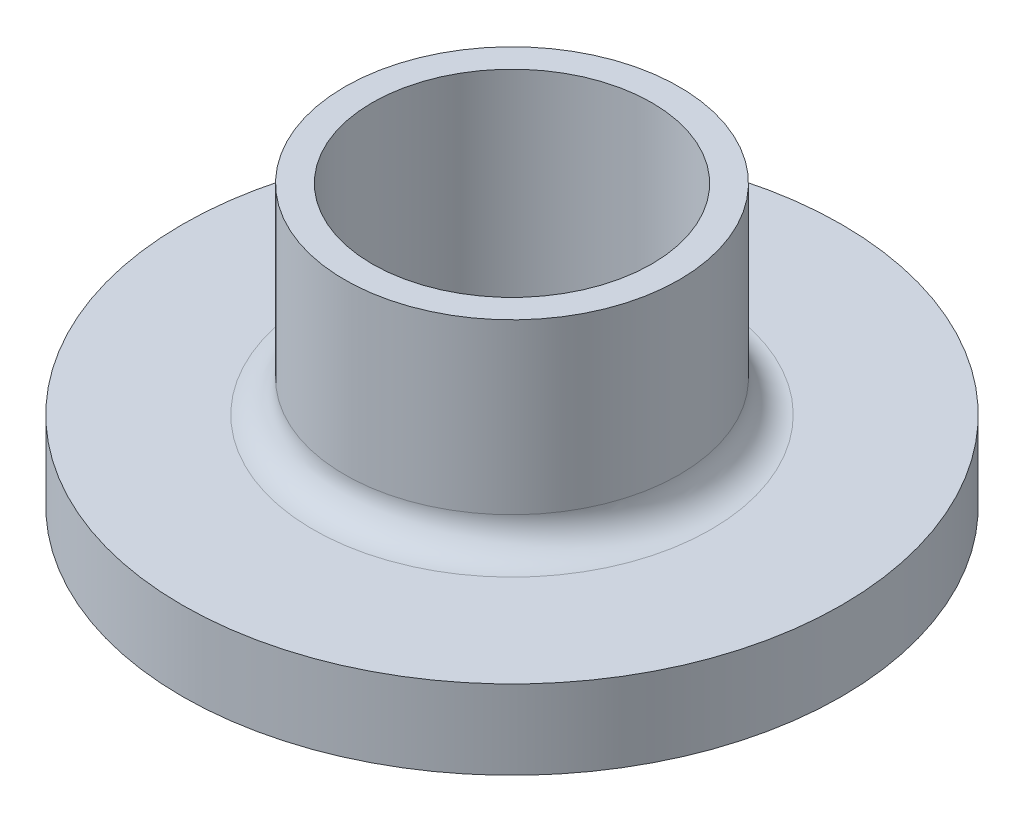
ISO-10303-21;
HEADER;
FILE_DESCRIPTION(('STEP AP214'),'2;1');
FILE_NAME('part.step','',(''),(''),'','','');
FILE_SCHEMA(('AUTOMOTIVE_DESIGN { 1 0 10303 214 1 1 1 1 }'));
ENDSEC;
DATA;
#1=APPLICATION_CONTEXT('core data for automotive mechanical design processes');
#2=APPLICATION_PROTOCOL_DEFINITION('international standard','automotive_design',2000,#1);
#3=PRODUCT_CONTEXT('',#1,'mechanical');
#4=PRODUCT('Part','Part','',(#3));
#5=PRODUCT_RELATED_PRODUCT_CATEGORY('part','',(#4));
#6=PRODUCT_DEFINITION_FORMATION('','',#4);
#7=PRODUCT_DEFINITION_CONTEXT('part definition',#1,'design');
#8=PRODUCT_DEFINITION('design','',#6,#7);
#9=PRODUCT_DEFINITION_SHAPE('','',#8);
#10=(LENGTH_UNIT() NAMED_UNIT(*) SI_UNIT(.MILLI.,.METRE.));
#11=(NAMED_UNIT(*) PLANE_ANGLE_UNIT() SI_UNIT($,.RADIAN.));
#12=(NAMED_UNIT(*) SI_UNIT($,.STERADIAN.) SOLID_ANGLE_UNIT());
#13=UNCERTAINTY_MEASURE_WITH_UNIT(LENGTH_MEASURE(1.E-05),#10,'distance_accuracy_value','');
#14=(GEOMETRIC_REPRESENTATION_CONTEXT(3) GLOBAL_UNCERTAINTY_ASSIGNED_CONTEXT((#13)) GLOBAL_UNIT_ASSIGNED_CONTEXT((#10,
#11,#12)) REPRESENTATION_CONTEXT('',''));
#15=CARTESIAN_POINT('',(0.,0.,0.));
#16=DIRECTION('',(0.,0.,1.));
#17=DIRECTION('',(1.,0.,0.));
#18=AXIS2_PLACEMENT_3D('',#15,#16,#17);
#19=CARTESIAN_POINT('',(7.9375,1.905,0.));
#20=DIRECTION('',(0.,-1.,0.));
#21=DIRECTION('',(1.,0.,0.));
#22=AXIS2_PLACEMENT_3D('',#19,#20,#21);
#23=PLANE('',#22);
#24=CARTESIAN_POINT('',(0.,1.905,0.));
#25=DIRECTION('',(0.,-1.,0.));
#26=DIRECTION('',(1.,0.,0.));
#27=AXIS2_PLACEMENT_3D('',#24,#25,#26);
#28=CIRCLE('',#27,4.7879);
#29=CARTESIAN_POINT('',(4.7879,1.905,0.));
#30=VERTEX_POINT('',#29);
#31=EDGE_CURVE('E10',#30,#30,#28,.T.);
#32=ORIENTED_EDGE('',*,*,#31,.T.);
#33=EDGE_LOOP('',(#32));
#34=FACE_BOUND('',#33,.T.);
#35=CARTESIAN_POINT('',(0.,1.905,0.));
#36=DIRECTION('',(0.,1.,0.));
#37=DIRECTION('',(-1.,0.,0.));
#38=AXIS2_PLACEMENT_3D('',#35,#36,#37);
#39=CIRCLE('',#38,7.9375);
#40=CARTESIAN_POINT('',(-7.9375,1.905,0.));
#41=VERTEX_POINT('',#40);
#42=EDGE_CURVE('E42',#41,#41,#39,.T.);
#43=ORIENTED_EDGE('',*,*,#42,.T.);
#44=EDGE_LOOP('',(#43));
#45=FACE_BOUND('',#44,.T.);
#46=ADVANCED_FACE('F31',(#34,#45),#23,.F.);
#47=CARTESIAN_POINT('',(0.,17.130002104646,0.));
#48=DIRECTION('',(0.,1.,0.));
#49=DIRECTION('',(-1.,0.,0.));
#50=AXIS2_PLACEMENT_3D('',#47,#48,#49);
#51=CYLINDRICAL_SURFACE('',#50,7.9375);
#52=ORIENTED_EDGE('',*,*,#42,.F.);
#53=EDGE_LOOP('',(#52));
#54=FACE_BOUND('',#53,.T.);
#55=CARTESIAN_POINT('',(0.,0.,0.));
#56=DIRECTION('',(0.,1.,0.));
#57=DIRECTION('',(-1.,0.,0.));
#58=AXIS2_PLACEMENT_3D('',#55,#56,#57);
#59=CIRCLE('',#58,7.9375);
#60=CARTESIAN_POINT('',(-7.9375,0.,0.));
#61=VERTEX_POINT('',#60);
#62=EDGE_CURVE('E46',#61,#61,#59,.T.);
#63=ORIENTED_EDGE('',*,*,#62,.T.);
#64=EDGE_LOOP('',(#63));
#65=FACE_BOUND('',#64,.T.);
#66=ADVANCED_FACE('F75',(#54,#65),#51,.T.);
#67=CARTESIAN_POINT('',(3.3655,0.,0.));
#68=DIRECTION('',(0.,1.,0.));
#69=DIRECTION('',(-1.,0.,0.));
#70=AXIS2_PLACEMENT_3D('',#67,#68,#69);
#71=PLANE('',#70);
#72=ORIENTED_EDGE('',*,*,#62,.F.);
#73=EDGE_LOOP('',(#72));
#74=FACE_BOUND('',#73,.T.);
#75=CARTESIAN_POINT('',(0.,0.,0.));
#76=DIRECTION('',(0.,1.,0.));
#77=DIRECTION('',(-1.,0.,0.));
#78=AXIS2_PLACEMENT_3D('',#75,#76,#77);
#79=CIRCLE('',#78,3.3655);
#80=CARTESIAN_POINT('',(-3.3655,0.,0.));
#81=VERTEX_POINT('',#80);
#82=EDGE_CURVE('E51',#81,#81,#79,.T.);
#83=ORIENTED_EDGE('',*,*,#82,.T.);
#84=EDGE_LOOP('',(#83));
#85=FACE_BOUND('',#84,.T.);
#86=ADVANCED_FACE('F79',(#74,#85),#71,.F.);
#87=CARTESIAN_POINT('',(0.,17.130002104646,0.));
#88=DIRECTION('',(0.,1.,0.));
#89=DIRECTION('',(-1.,0.,0.));
#90=AXIS2_PLACEMENT_3D('',#87,#88,#89);
#91=CYLINDRICAL_SURFACE('',#90,3.3655);
#92=ORIENTED_EDGE('',*,*,#82,.F.);
#93=EDGE_LOOP('',(#92));
#94=FACE_BOUND('',#93,.T.);
#95=CARTESIAN_POINT('',(0.,6.731,0.));
#96=DIRECTION('',(0.,1.,0.));
#97=DIRECTION('',(-1.,0.,0.));
#98=AXIS2_PLACEMENT_3D('',#95,#96,#97);
#99=CIRCLE('',#98,3.3655);
#100=CARTESIAN_POINT('',(-3.3655,6.731,0.));
#101=VERTEX_POINT('',#100);
#102=EDGE_CURVE('E54',#101,#101,#99,.T.);
#103=ORIENTED_EDGE('',*,*,#102,.T.);
#104=EDGE_LOOP('',(#103));
#105=FACE_BOUND('',#104,.T.);
#106=ADVANCED_FACE('F71',(#94,#105),#91,.F.);
#107=CARTESIAN_POINT('',(4.0259,6.731,0.));
#108=DIRECTION('',(0.,-1.,0.));
#109=DIRECTION('',(1.,0.,0.));
#110=AXIS2_PLACEMENT_3D('',#107,#108,#109);
#111=PLANE('',#110);
#112=ORIENTED_EDGE('',*,*,#102,.F.);
#113=EDGE_LOOP('',(#112));
#114=FACE_BOUND('',#113,.T.);
#115=CARTESIAN_POINT('',(0.,6.731,0.));
#116=DIRECTION('',(0.,1.,0.));
#117=DIRECTION('',(-1.,0.,0.));
#118=AXIS2_PLACEMENT_3D('',#115,#116,#117);
#119=CIRCLE('',#118,4.0259);
#120=CARTESIAN_POINT('',(-4.0259,6.731,0.));
#121=VERTEX_POINT('',#120);
#122=EDGE_CURVE('E57',#121,#121,#119,.T.);
#123=ORIENTED_EDGE('',*,*,#122,.T.);
#124=EDGE_LOOP('',(#123));
#125=FACE_BOUND('',#124,.T.);
#126=ADVANCED_FACE('F61',(#114,#125),#111,.F.);
#127=CARTESIAN_POINT('',(0.,17.130002104646,0.));
#128=DIRECTION('',(0.,1.,0.));
#129=DIRECTION('',(-1.,0.,0.));
#130=AXIS2_PLACEMENT_3D('',#127,#128,#129);
#131=CYLINDRICAL_SURFACE('',#130,4.0259);
#132=CARTESIAN_POINT('',(0.,2.667,0.));
#133=DIRECTION('',(0.,-1.,0.));
#134=DIRECTION('',(1.,0.,0.));
#135=AXIS2_PLACEMENT_3D('',#132,#133,#134);
#136=CIRCLE('',#135,4.0259);
#137=CARTESIAN_POINT('',(4.0259,2.667,0.));
#138=VERTEX_POINT('',#137);
#139=EDGE_CURVE('E38',#138,#138,#136,.F.);
#140=ORIENTED_EDGE('',*,*,#139,.T.);
#141=EDGE_LOOP('',(#140));
#142=FACE_BOUND('',#141,.T.);
#143=ORIENTED_EDGE('',*,*,#122,.F.);
#144=EDGE_LOOP('',(#143));
#145=FACE_BOUND('',#144,.T.);
#146=ADVANCED_FACE('F63',(#142,#145),#131,.T.);
#147=CARTESIAN_POINT('',(0.,2.667,0.));
#148=DIRECTION('',(0.,-1.,0.));
#149=DIRECTION('',(1.,0.,0.));
#150=AXIS2_PLACEMENT_3D('',#147,#148,#149);
#151=TOROIDAL_SURFACE('',#150,4.7879,0.762);
#152=ORIENTED_EDGE('',*,*,#31,.F.);
#153=EDGE_LOOP('',(#152));
#154=FACE_BOUND('',#153,.T.);
#155=ORIENTED_EDGE('',*,*,#139,.F.);
#156=EDGE_LOOP('',(#155));
#157=FACE_BOUND('',#156,.T.);
#158=ADVANCED_FACE('F33',(#154,#157),#151,.F.);
#159=CLOSED_SHELL('',(#46,#66,#86,#106,#126,#146,#158));
#160=MANIFOLD_SOLID_BREP('B2',#159);
#161=ADVANCED_BREP_SHAPE_REPRESENTATION('',(#18,#160),#14);
#162=SHAPE_DEFINITION_REPRESENTATION(#9,#161);
ENDSEC;
END-ISO-10303-21;
